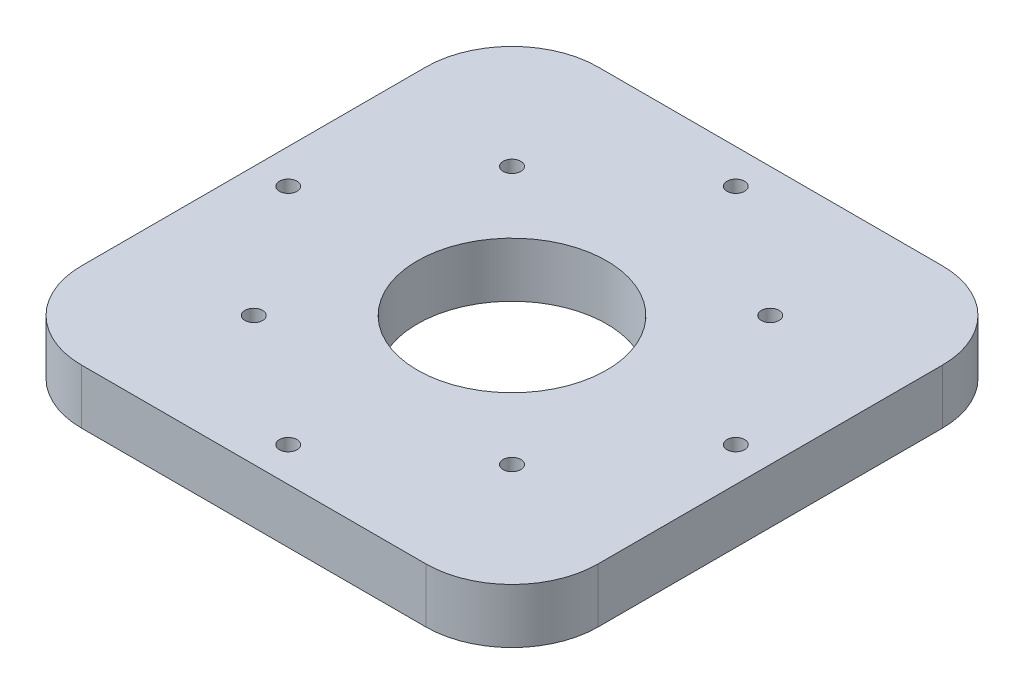
ISO-10303-21;
HEADER;
FILE_DESCRIPTION(('STEP AP214'),'2;1');
FILE_NAME('part.step','',(''),(''),'','','');
FILE_SCHEMA(('AUTOMOTIVE_DESIGN { 1 0 10303 214 1 1 1 1 }'));
ENDSEC;
DATA;
#1=APPLICATION_CONTEXT('core data for automotive mechanical design processes');
#2=APPLICATION_PROTOCOL_DEFINITION('international standard','automotive_design',2000,#1);
#3=PRODUCT_CONTEXT('',#1,'mechanical');
#4=PRODUCT('Part','Part','',(#3));
#5=PRODUCT_RELATED_PRODUCT_CATEGORY('part','',(#4));
#6=PRODUCT_DEFINITION_FORMATION('','',#4);
#7=PRODUCT_DEFINITION_CONTEXT('part definition',#1,'design');
#8=PRODUCT_DEFINITION('design','',#6,#7);
#9=PRODUCT_DEFINITION_SHAPE('','',#8);
#10=(LENGTH_UNIT() NAMED_UNIT(*) SI_UNIT(.MILLI.,.METRE.));
#11=(NAMED_UNIT(*) PLANE_ANGLE_UNIT() SI_UNIT($,.RADIAN.));
#12=(NAMED_UNIT(*) SI_UNIT($,.STERADIAN.) SOLID_ANGLE_UNIT());
#13=UNCERTAINTY_MEASURE_WITH_UNIT(LENGTH_MEASURE(1.E-05),#10,'distance_accuracy_value','');
#14=(GEOMETRIC_REPRESENTATION_CONTEXT(3) GLOBAL_UNCERTAINTY_ASSIGNED_CONTEXT((#13)) GLOBAL_UNIT_ASSIGNED_CONTEXT((#10,
#11,#12)) REPRESENTATION_CONTEXT('',''));
#15=CARTESIAN_POINT('',(0.,0.,0.));
#16=DIRECTION('',(0.,0.,1.));
#17=DIRECTION('',(1.,0.,0.));
#18=AXIS2_PLACEMENT_3D('',#15,#16,#17);
#19=CARTESIAN_POINT('',(0.,6.35,0.));
#20=DIRECTION('',(0.,1.,0.));
#21=DIRECTION('',(0.,0.,1.));
#22=AXIS2_PLACEMENT_3D('',#19,#20,#21);
#23=PLANE('',#22);
#24=CARTESIAN_POINT('',(44.,6.35,76.6703662597115));
#25=DIRECTION('',(0.,1.,0.));
#26=DIRECTION('',(0.,0.,1.));
#27=AXIS2_PLACEMENT_3D('',#24,#25,#26);
#28=CIRCLE('',#27,1.025);
#29=CARTESIAN_POINT('',(44.,6.35,77.6953662597114));
#30=VERTEX_POINT('',#29);
#31=EDGE_CURVE('E226',#30,#30,#28,.T.);
#32=ORIENTED_EDGE('',*,*,#31,.F.);
#33=EDGE_LOOP('',(#32));
#34=FACE_BOUND('',#33,.T.);
#35=CARTESIAN_POINT('',(96.,6.35,76.6703662597115));
#36=DIRECTION('',(0.,1.,0.));
#37=DIRECTION('',(0.,0.,1.));
#38=AXIS2_PLACEMENT_3D('',#35,#36,#37);
#39=CIRCLE('',#38,1.025);
#40=CARTESIAN_POINT('',(96.,6.35,77.6953662597114));
#41=VERTEX_POINT('',#40);
#42=EDGE_CURVE('E220',#41,#41,#39,.T.);
#43=ORIENTED_EDGE('',*,*,#42,.F.);
#44=EDGE_LOOP('',(#43));
#45=FACE_BOUND('',#44,.T.);
#46=CARTESIAN_POINT('',(70.,6.35,50.6703662597115));
#47=DIRECTION('',(0.,1.,0.));
#48=DIRECTION('',(0.,0.,1.));
#49=AXIS2_PLACEMENT_3D('',#46,#47,#48);
#50=CIRCLE('',#49,1.025);
#51=CARTESIAN_POINT('',(70.,6.35,51.6953662597115));
#52=VERTEX_POINT('',#51);
#53=EDGE_CURVE('E214',#52,#52,#50,.T.);
#54=ORIENTED_EDGE('',*,*,#53,.F.);
#55=EDGE_LOOP('',(#54));
#56=FACE_BOUND('',#55,.T.);
#57=CARTESIAN_POINT('',(70.,6.35,102.670366259711));
#58=DIRECTION('',(0.,1.,0.));
#59=DIRECTION('',(0.,0.,1.));
#60=AXIS2_PLACEMENT_3D('',#57,#58,#59);
#61=CIRCLE('',#60,1.025);
#62=CARTESIAN_POINT('',(70.,6.35,103.695366259711));
#63=VERTEX_POINT('',#62);
#64=EDGE_CURVE('E208',#63,#63,#61,.T.);
#65=ORIENTED_EDGE('',*,*,#64,.F.);
#66=EDGE_LOOP('',(#65));
#67=FACE_BOUND('',#66,.T.);
#68=CARTESIAN_POINT('',(85.,6.35,91.6703662597114));
#69=DIRECTION('',(0.,1.,0.));
#70=DIRECTION('',(0.,0.,1.));
#71=AXIS2_PLACEMENT_3D('',#68,#69,#70);
#72=CIRCLE('',#71,1.025);
#73=CARTESIAN_POINT('',(85.,6.35,92.6953662597114));
#74=VERTEX_POINT('',#73);
#75=EDGE_CURVE('E193',#74,#74,#72,.T.);
#76=ORIENTED_EDGE('',*,*,#75,.F.);
#77=EDGE_LOOP('',(#76));
#78=FACE_BOUND('',#77,.T.);
#79=CARTESIAN_POINT('',(55.,6.35,61.6703662597115));
#80=DIRECTION('',(0.,1.,0.));
#81=DIRECTION('',(0.,0.,1.));
#82=AXIS2_PLACEMENT_3D('',#79,#80,#81);
#83=CIRCLE('',#82,1.025);
#84=CARTESIAN_POINT('',(55.,6.35,62.6953662597114));
#85=VERTEX_POINT('',#84);
#86=EDGE_CURVE('E182',#85,#85,#83,.T.);
#87=ORIENTED_EDGE('',*,*,#86,.F.);
#88=EDGE_LOOP('',(#87));
#89=FACE_BOUND('',#88,.T.);
#90=DIRECTION('',(1.,0.,0.));
#91=VECTOR('',#90,1.);
#92=CARTESIAN_POINT('',(40.,6.35,106.670366259711));
#93=LINE('',#92,#91);
#94=CARTESIAN_POINT('',(50.,6.35,106.670366259711));
#95=VERTEX_POINT('',#94);
#96=CARTESIAN_POINT('',(90.,6.35,106.670366259711));
#97=VERTEX_POINT('',#96);
#98=EDGE_CURVE('E168',#95,#97,#93,.T.);
#99=ORIENTED_EDGE('',*,*,#98,.T.);
#100=CARTESIAN_POINT('',(90.,6.35,96.6703662597115));
#101=DIRECTION('',(0.,1.,0.));
#102=DIRECTION('',(0.,0.,1.));
#103=AXIS2_PLACEMENT_3D('',#100,#101,#102);
#104=CIRCLE('',#103,10.);
#105=CARTESIAN_POINT('',(100.,6.35,96.6703662597115));
#106=VERTEX_POINT('',#105);
#107=EDGE_CURVE('E149',#97,#106,#104,.T.);
#108=ORIENTED_EDGE('',*,*,#107,.T.);
#109=DIRECTION('',(0.,0.,-1.));
#110=VECTOR('',#109,1.);
#111=CARTESIAN_POINT('',(100.,6.35,46.6703662597115));
#112=LINE('',#111,#110);
#113=CARTESIAN_POINT('',(100.,6.35,56.6703662597115));
#114=VERTEX_POINT('',#113);
#115=EDGE_CURVE('E119',#106,#114,#112,.T.);
#116=ORIENTED_EDGE('',*,*,#115,.T.);
#117=CARTESIAN_POINT('',(90.,6.35,56.6703662597115));
#118=DIRECTION('',(0.,1.,0.));
#119=DIRECTION('',(0.,0.,1.));
#120=AXIS2_PLACEMENT_3D('',#117,#118,#119);
#121=CIRCLE('',#120,10.);
#122=CARTESIAN_POINT('',(90.,6.35,46.6703662597115));
#123=VERTEX_POINT('',#122);
#124=EDGE_CURVE('E55',#114,#123,#121,.T.);
#125=ORIENTED_EDGE('',*,*,#124,.T.);
#126=DIRECTION('',(-1.,0.,0.));
#127=VECTOR('',#126,1.);
#128=CARTESIAN_POINT('',(40.,6.35,46.6703662597115));
#129=LINE('',#128,#127);
#130=CARTESIAN_POINT('',(50.,6.35,46.6703662597115));
#131=VERTEX_POINT('',#130);
#132=EDGE_CURVE('E135',#123,#131,#129,.T.);
#133=ORIENTED_EDGE('',*,*,#132,.T.);
#134=CARTESIAN_POINT('',(50.,6.35,56.6703662597115));
#135=DIRECTION('',(0.,1.,0.));
#136=DIRECTION('',(0.,0.,1.));
#137=AXIS2_PLACEMENT_3D('',#134,#135,#136);
#138=CIRCLE('',#137,10.);
#139=CARTESIAN_POINT('',(40.,6.35,56.6703662597115));
#140=VERTEX_POINT('',#139);
#141=EDGE_CURVE('E146',#131,#140,#138,.T.);
#142=ORIENTED_EDGE('',*,*,#141,.T.);
#143=DIRECTION('',(0.,0.,1.));
#144=VECTOR('',#143,1.);
#145=CARTESIAN_POINT('',(40.,6.35,46.6703662597115));
#146=LINE('',#145,#144);
#147=CARTESIAN_POINT('',(40.,6.35,96.6703662597115));
#148=VERTEX_POINT('',#147);
#149=EDGE_CURVE('E129',#140,#148,#146,.T.);
#150=ORIENTED_EDGE('',*,*,#149,.T.);
#151=CARTESIAN_POINT('',(50.,6.35,96.6703662597115));
#152=DIRECTION('',(0.,1.,0.));
#153=DIRECTION('',(0.,0.,1.));
#154=AXIS2_PLACEMENT_3D('',#151,#152,#153);
#155=CIRCLE('',#154,10.);
#156=EDGE_CURVE('E144',#148,#95,#155,.T.);
#157=ORIENTED_EDGE('',*,*,#156,.T.);
#158=EDGE_LOOP('',(#99,#108,#116,#125,#133,#142,#150,#157));
#159=FACE_BOUND('',#158,.T.);
#160=CARTESIAN_POINT('',(70.,6.35,76.6703662597115));
#161=DIRECTION('',(0.,1.,0.));
#162=DIRECTION('',(0.,0.,1.));
#163=AXIS2_PLACEMENT_3D('',#160,#161,#162);
#164=CIRCLE('',#163,11.);
#165=CARTESIAN_POINT('',(70.,6.35,87.6703662597114));
#166=VERTEX_POINT('',#165);
#167=EDGE_CURVE('E173',#166,#166,#164,.T.);
#168=ORIENTED_EDGE('',*,*,#167,.F.);
#169=EDGE_LOOP('',(#168));
#170=FACE_BOUND('',#169,.T.);
#171=CARTESIAN_POINT('',(85.,6.35,61.6703662597115));
#172=DIRECTION('',(0.,1.,0.));
#173=DIRECTION('',(0.,0.,1.));
#174=AXIS2_PLACEMENT_3D('',#171,#172,#173);
#175=CIRCLE('',#174,1.025);
#176=CARTESIAN_POINT('',(85.,6.35,62.6953662597114));
#177=VERTEX_POINT('',#176);
#178=EDGE_CURVE('E187',#177,#177,#175,.T.);
#179=ORIENTED_EDGE('',*,*,#178,.F.);
#180=EDGE_LOOP('',(#179));
#181=FACE_BOUND('',#180,.T.);
#182=CARTESIAN_POINT('',(55.,6.35,91.6703662597114));
#183=DIRECTION('',(0.,1.,0.));
#184=DIRECTION('',(0.,0.,1.));
#185=AXIS2_PLACEMENT_3D('',#182,#183,#184);
#186=CIRCLE('',#185,1.025);
#187=CARTESIAN_POINT('',(55.,6.35,92.6953662597114));
#188=VERTEX_POINT('',#187);
#189=EDGE_CURVE('E199',#188,#188,#186,.T.);
#190=ORIENTED_EDGE('',*,*,#189,.F.);
#191=EDGE_LOOP('',(#190));
#192=FACE_BOUND('',#191,.T.);
#193=ADVANCED_FACE('F33',(#34,#45,#56,#67,#78,#89,#159,#170,#181,#192),#23,.T.);
#194=CARTESIAN_POINT('',(0.,0.,0.));
#195=DIRECTION('',(0.,1.,0.));
#196=DIRECTION('',(0.,0.,1.));
#197=AXIS2_PLACEMENT_3D('',#194,#195,#196);
#198=PLANE('',#197);
#199=CARTESIAN_POINT('',(44.,0.,76.6703662597115));
#200=DIRECTION('',(0.,1.,0.));
#201=DIRECTION('',(0.,0.,1.));
#202=AXIS2_PLACEMENT_3D('',#199,#200,#201);
#203=CIRCLE('',#202,1.025);
#204=CARTESIAN_POINT('',(44.,0.,77.6953662597114));
#205=VERTEX_POINT('',#204);
#206=EDGE_CURVE('E205',#205,#205,#203,.T.);
#207=ORIENTED_EDGE('',*,*,#206,.T.);
#208=EDGE_LOOP('',(#207));
#209=FACE_BOUND('',#208,.T.);
#210=CARTESIAN_POINT('',(96.,0.,76.6703662597115));
#211=DIRECTION('',(0.,1.,0.));
#212=DIRECTION('',(0.,0.,1.));
#213=AXIS2_PLACEMENT_3D('',#210,#211,#212);
#214=CIRCLE('',#213,1.025);
#215=CARTESIAN_POINT('',(96.,0.,77.6953662597114));
#216=VERTEX_POINT('',#215);
#217=EDGE_CURVE('E223',#216,#216,#214,.T.);
#218=ORIENTED_EDGE('',*,*,#217,.T.);
#219=EDGE_LOOP('',(#218));
#220=FACE_BOUND('',#219,.T.);
#221=CARTESIAN_POINT('',(70.,0.,50.6703662597115));
#222=DIRECTION('',(0.,1.,0.));
#223=DIRECTION('',(0.,0.,1.));
#224=AXIS2_PLACEMENT_3D('',#221,#222,#223);
#225=CIRCLE('',#224,1.025);
#226=CARTESIAN_POINT('',(70.,0.,51.6953662597115));
#227=VERTEX_POINT('',#226);
#228=EDGE_CURVE('E217',#227,#227,#225,.T.);
#229=ORIENTED_EDGE('',*,*,#228,.T.);
#230=EDGE_LOOP('',(#229));
#231=FACE_BOUND('',#230,.T.);
#232=CARTESIAN_POINT('',(70.,0.,102.670366259711));
#233=DIRECTION('',(0.,1.,0.));
#234=DIRECTION('',(0.,0.,1.));
#235=AXIS2_PLACEMENT_3D('',#232,#233,#234);
#236=CIRCLE('',#235,1.025);
#237=CARTESIAN_POINT('',(70.,0.,103.695366259711));
#238=VERTEX_POINT('',#237);
#239=EDGE_CURVE('E211',#238,#238,#236,.T.);
#240=ORIENTED_EDGE('',*,*,#239,.T.);
#241=EDGE_LOOP('',(#240));
#242=FACE_BOUND('',#241,.T.);
#243=DIRECTION('',(0.,0.,-1.));
#244=VECTOR('',#243,1.);
#245=CARTESIAN_POINT('',(100.,0.,46.6703662597115));
#246=LINE('',#245,#244);
#247=CARTESIAN_POINT('',(100.,0.,96.6703662597115));
#248=VERTEX_POINT('',#247);
#249=CARTESIAN_POINT('',(100.,0.,56.6703662597115));
#250=VERTEX_POINT('',#249);
#251=EDGE_CURVE('E117',#248,#250,#246,.T.);
#252=ORIENTED_EDGE('',*,*,#251,.F.);
#253=CARTESIAN_POINT('',(90.,0.,96.6703662597115));
#254=DIRECTION('',(0.,1.,0.));
#255=DIRECTION('',(0.,0.,1.));
#256=AXIS2_PLACEMENT_3D('',#253,#254,#255);
#257=CIRCLE('',#256,10.);
#258=CARTESIAN_POINT('',(90.,0.,106.670366259711));
#259=VERTEX_POINT('',#258);
#260=EDGE_CURVE('E100',#248,#259,#257,.F.);
#261=ORIENTED_EDGE('',*,*,#260,.T.);
#262=DIRECTION('',(1.,0.,0.));
#263=VECTOR('',#262,1.);
#264=CARTESIAN_POINT('',(40.,0.,106.670366259711));
#265=LINE('',#264,#263);
#266=CARTESIAN_POINT('',(50.,0.,106.670366259711));
#267=VERTEX_POINT('',#266);
#268=EDGE_CURVE('E127',#267,#259,#265,.T.);
#269=ORIENTED_EDGE('',*,*,#268,.F.);
#270=CARTESIAN_POINT('',(50.,0.,96.6703662597115));
#271=DIRECTION('',(0.,1.,0.));
#272=DIRECTION('',(0.,0.,1.));
#273=AXIS2_PLACEMENT_3D('',#270,#271,#272);
#274=CIRCLE('',#273,10.);
#275=CARTESIAN_POINT('',(40.,0.,96.6703662597115));
#276=VERTEX_POINT('',#275);
#277=EDGE_CURVE('E120',#267,#276,#274,.F.);
#278=ORIENTED_EDGE('',*,*,#277,.T.);
#279=DIRECTION('',(0.,0.,1.));
#280=VECTOR('',#279,1.);
#281=CARTESIAN_POINT('',(40.,0.,46.6703662597115));
#282=LINE('',#281,#280);
#283=CARTESIAN_POINT('',(40.,0.,56.6703662597115));
#284=VERTEX_POINT('',#283);
#285=EDGE_CURVE('E131',#284,#276,#282,.T.);
#286=ORIENTED_EDGE('',*,*,#285,.F.);
#287=CARTESIAN_POINT('',(50.,0.,56.6703662597115));
#288=DIRECTION('',(0.,1.,0.));
#289=DIRECTION('',(0.,0.,1.));
#290=AXIS2_PLACEMENT_3D('',#287,#288,#289);
#291=CIRCLE('',#290,10.);
#292=CARTESIAN_POINT('',(50.,0.,46.6703662597115));
#293=VERTEX_POINT('',#292);
#294=EDGE_CURVE('E138',#284,#293,#291,.F.);
#295=ORIENTED_EDGE('',*,*,#294,.T.);
#296=DIRECTION('',(-1.,0.,0.));
#297=VECTOR('',#296,1.);
#298=CARTESIAN_POINT('',(40.,0.,46.6703662597115));
#299=LINE('',#298,#297);
#300=CARTESIAN_POINT('',(90.,0.,46.6703662597115));
#301=VERTEX_POINT('',#300);
#302=EDGE_CURVE('E126',#301,#293,#299,.T.);
#303=ORIENTED_EDGE('',*,*,#302,.F.);
#304=CARTESIAN_POINT('',(90.,0.,56.6703662597115));
#305=DIRECTION('',(0.,1.,0.));
#306=DIRECTION('',(0.,0.,1.));
#307=AXIS2_PLACEMENT_3D('',#304,#305,#306);
#308=CIRCLE('',#307,10.);
#309=EDGE_CURVE('E111',#301,#250,#308,.F.);
#310=ORIENTED_EDGE('',*,*,#309,.T.);
#311=EDGE_LOOP('',(#252,#261,#269,#278,#286,#295,#303,#310));
#312=FACE_BOUND('',#311,.T.);
#313=CARTESIAN_POINT('',(70.,0.,76.6703662597115));
#314=DIRECTION('',(0.,1.,0.));
#315=DIRECTION('',(0.,0.,1.));
#316=AXIS2_PLACEMENT_3D('',#313,#314,#315);
#317=CIRCLE('',#316,11.);
#318=CARTESIAN_POINT('',(70.,0.,87.6703662597114));
#319=VERTEX_POINT('',#318);
#320=EDGE_CURVE('E175',#319,#319,#317,.T.);
#321=ORIENTED_EDGE('',*,*,#320,.T.);
#322=EDGE_LOOP('',(#321));
#323=FACE_BOUND('',#322,.T.);
#324=CARTESIAN_POINT('',(55.,0.,61.6703662597115));
#325=DIRECTION('',(0.,1.,0.));
#326=DIRECTION('',(0.,0.,1.));
#327=AXIS2_PLACEMENT_3D('',#324,#325,#326);
#328=CIRCLE('',#327,1.025);
#329=CARTESIAN_POINT('',(55.,0.,62.6953662597114));
#330=VERTEX_POINT('',#329);
#331=EDGE_CURVE('E184',#330,#330,#328,.T.);
#332=ORIENTED_EDGE('',*,*,#331,.T.);
#333=EDGE_LOOP('',(#332));
#334=FACE_BOUND('',#333,.T.);
#335=CARTESIAN_POINT('',(85.,0.,61.6703662597115));
#336=DIRECTION('',(0.,1.,0.));
#337=DIRECTION('',(0.,0.,1.));
#338=AXIS2_PLACEMENT_3D('',#335,#336,#337);
#339=CIRCLE('',#338,1.025);
#340=CARTESIAN_POINT('',(85.,0.,62.6953662597114));
#341=VERTEX_POINT('',#340);
#342=EDGE_CURVE('E190',#341,#341,#339,.T.);
#343=ORIENTED_EDGE('',*,*,#342,.T.);
#344=EDGE_LOOP('',(#343));
#345=FACE_BOUND('',#344,.T.);
#346=CARTESIAN_POINT('',(85.,0.,91.6703662597114));
#347=DIRECTION('',(0.,1.,0.));
#348=DIRECTION('',(0.,0.,1.));
#349=AXIS2_PLACEMENT_3D('',#346,#347,#348);
#350=CIRCLE('',#349,1.025);
#351=CARTESIAN_POINT('',(85.,0.,92.6953662597114));
#352=VERTEX_POINT('',#351);
#353=EDGE_CURVE('E196',#352,#352,#350,.T.);
#354=ORIENTED_EDGE('',*,*,#353,.T.);
#355=EDGE_LOOP('',(#354));
#356=FACE_BOUND('',#355,.T.);
#357=CARTESIAN_POINT('',(55.,0.,91.6703662597114));
#358=DIRECTION('',(0.,1.,0.));
#359=DIRECTION('',(0.,0.,1.));
#360=AXIS2_PLACEMENT_3D('',#357,#358,#359);
#361=CIRCLE('',#360,1.025);
#362=CARTESIAN_POINT('',(55.,0.,92.6953662597114));
#363=VERTEX_POINT('',#362);
#364=EDGE_CURVE('E202',#363,#363,#361,.T.);
#365=ORIENTED_EDGE('',*,*,#364,.T.);
#366=EDGE_LOOP('',(#365));
#367=FACE_BOUND('',#366,.T.);
#368=ADVANCED_FACE('F123',(#209,#220,#231,#242,#312,#323,#334,#345,#356,#367),#198,.F.);
#369=CARTESIAN_POINT('',(40.,6.35,46.6703662597115));
#370=DIRECTION('',(1.,0.,0.));
#371=DIRECTION('',(0.,0.,-1.));
#372=AXIS2_PLACEMENT_3D('',#369,#370,#371);
#373=PLANE('',#372);
#374=ORIENTED_EDGE('',*,*,#149,.F.);
#375=DIRECTION('',(0.,-1.,0.));
#376=VECTOR('',#375,1.);
#377=CARTESIAN_POINT('',(40.,6.35,56.6703662597115));
#378=LINE('',#377,#376);
#379=EDGE_CURVE('E11',#140,#284,#378,.T.);
#380=ORIENTED_EDGE('',*,*,#379,.T.);
#381=ORIENTED_EDGE('',*,*,#285,.T.);
#382=DIRECTION('',(0.,-1.,0.));
#383=VECTOR('',#382,1.);
#384=CARTESIAN_POINT('',(40.,6.35,96.6703662597115));
#385=LINE('',#384,#383);
#386=EDGE_CURVE('E41',#276,#148,#385,.F.);
#387=ORIENTED_EDGE('',*,*,#386,.T.);
#388=EDGE_LOOP('',(#374,#380,#381,#387));
#389=FACE_BOUND('',#388,.T.);
#390=ADVANCED_FACE('F159',(#389),#373,.F.);
#391=CARTESIAN_POINT('',(40.,6.35,106.670366259711));
#392=DIRECTION('',(0.,0.,-1.));
#393=DIRECTION('',(-1.,0.,0.));
#394=AXIS2_PLACEMENT_3D('',#391,#392,#393);
#395=PLANE('',#394);
#396=ORIENTED_EDGE('',*,*,#268,.T.);
#397=DIRECTION('',(0.,-1.,0.));
#398=VECTOR('',#397,1.);
#399=CARTESIAN_POINT('',(90.,6.35,106.670366259711));
#400=LINE('',#399,#398);
#401=EDGE_CURVE('E105',#259,#97,#400,.F.);
#402=ORIENTED_EDGE('',*,*,#401,.T.);
#403=ORIENTED_EDGE('',*,*,#98,.F.);
#404=DIRECTION('',(0.,-1.,0.));
#405=VECTOR('',#404,1.);
#406=CARTESIAN_POINT('',(50.,6.35,106.670366259711));
#407=LINE('',#406,#405);
#408=EDGE_CURVE('E110',#95,#267,#407,.T.);
#409=ORIENTED_EDGE('',*,*,#408,.T.);
#410=EDGE_LOOP('',(#396,#402,#403,#409));
#411=FACE_BOUND('',#410,.T.);
#412=ADVANCED_FACE('F172',(#411),#395,.F.);
#413=CARTESIAN_POINT('',(100.,6.35,46.6703662597115));
#414=DIRECTION('',(-1.,0.,0.));
#415=DIRECTION('',(0.,0.,1.));
#416=AXIS2_PLACEMENT_3D('',#413,#414,#415);
#417=PLANE('',#416);
#418=ORIENTED_EDGE('',*,*,#115,.F.);
#419=DIRECTION('',(0.,-1.,0.));
#420=VECTOR('',#419,1.);
#421=CARTESIAN_POINT('',(100.,6.35,96.6703662597115));
#422=LINE('',#421,#420);
#423=EDGE_CURVE('E104',#106,#248,#422,.T.);
#424=ORIENTED_EDGE('',*,*,#423,.T.);
#425=ORIENTED_EDGE('',*,*,#251,.T.);
#426=DIRECTION('',(0.,-1.,0.));
#427=VECTOR('',#426,1.);
#428=CARTESIAN_POINT('',(100.,6.35,56.6703662597115));
#429=LINE('',#428,#427);
#430=EDGE_CURVE('E121',#250,#114,#429,.F.);
#431=ORIENTED_EDGE('',*,*,#430,.T.);
#432=EDGE_LOOP('',(#418,#424,#425,#431));
#433=FACE_BOUND('',#432,.T.);
#434=ADVANCED_FACE('F116',(#433),#417,.F.);
#435=CARTESIAN_POINT('',(40.,6.35,46.6703662597115));
#436=DIRECTION('',(0.,0.,1.));
#437=DIRECTION('',(1.,0.,0.));
#438=AXIS2_PLACEMENT_3D('',#435,#436,#437);
#439=PLANE('',#438);
#440=ORIENTED_EDGE('',*,*,#132,.F.);
#441=DIRECTION('',(0.,-1.,0.));
#442=VECTOR('',#441,1.);
#443=CARTESIAN_POINT('',(90.,6.35,46.6703662597115));
#444=LINE('',#443,#442);
#445=EDGE_CURVE('E152',#123,#301,#444,.T.);
#446=ORIENTED_EDGE('',*,*,#445,.T.);
#447=ORIENTED_EDGE('',*,*,#302,.T.);
#448=DIRECTION('',(0.,-1.,0.));
#449=VECTOR('',#448,1.);
#450=CARTESIAN_POINT('',(50.,6.35,46.6703662597115));
#451=LINE('',#450,#449);
#452=EDGE_CURVE('E48',#293,#131,#451,.F.);
#453=ORIENTED_EDGE('',*,*,#452,.T.);
#454=EDGE_LOOP('',(#440,#446,#447,#453));
#455=FACE_BOUND('',#454,.T.);
#456=ADVANCED_FACE('F292',(#455),#439,.F.);
#457=CARTESIAN_POINT('',(70.,6.35,76.6703662597115));
#458=DIRECTION('',(0.,-1.,0.));
#459=DIRECTION('',(0.,0.,-1.));
#460=AXIS2_PLACEMENT_3D('',#457,#458,#459);
#461=CYLINDRICAL_SURFACE('',#460,11.);
#462=ORIENTED_EDGE('',*,*,#167,.T.);
#463=EDGE_LOOP('',(#462));
#464=FACE_BOUND('',#463,.T.);
#465=ORIENTED_EDGE('',*,*,#320,.F.);
#466=EDGE_LOOP('',(#465));
#467=FACE_BOUND('',#466,.T.);
#468=ADVANCED_FACE('F258',(#464,#467),#461,.F.);
#469=CARTESIAN_POINT('',(55.,6.35,61.6703662597115));
#470=DIRECTION('',(0.,-1.,0.));
#471=DIRECTION('',(0.,0.,-1.));
#472=AXIS2_PLACEMENT_3D('',#469,#470,#471);
#473=CYLINDRICAL_SURFACE('',#472,1.025);
#474=ORIENTED_EDGE('',*,*,#86,.T.);
#475=EDGE_LOOP('',(#474));
#476=FACE_BOUND('',#475,.T.);
#477=ORIENTED_EDGE('',*,*,#331,.F.);
#478=EDGE_LOOP('',(#477));
#479=FACE_BOUND('',#478,.T.);
#480=ADVANCED_FACE('F254',(#476,#479),#473,.F.);
#481=CARTESIAN_POINT('',(85.,6.35,61.6703662597115));
#482=DIRECTION('',(0.,-1.,0.));
#483=DIRECTION('',(0.,0.,-1.));
#484=AXIS2_PLACEMENT_3D('',#481,#482,#483);
#485=CYLINDRICAL_SURFACE('',#484,1.025);
#486=ORIENTED_EDGE('',*,*,#178,.T.);
#487=EDGE_LOOP('',(#486));
#488=FACE_BOUND('',#487,.T.);
#489=ORIENTED_EDGE('',*,*,#342,.F.);
#490=EDGE_LOOP('',(#489));
#491=FACE_BOUND('',#490,.T.);
#492=ADVANCED_FACE('F257',(#488,#491),#485,.F.);
#493=CARTESIAN_POINT('',(85.,6.35,91.6703662597114));
#494=DIRECTION('',(0.,-1.,0.));
#495=DIRECTION('',(0.,0.,-1.));
#496=AXIS2_PLACEMENT_3D('',#493,#494,#495);
#497=CYLINDRICAL_SURFACE('',#496,1.025);
#498=ORIENTED_EDGE('',*,*,#75,.T.);
#499=EDGE_LOOP('',(#498));
#500=FACE_BOUND('',#499,.T.);
#501=ORIENTED_EDGE('',*,*,#353,.F.);
#502=EDGE_LOOP('',(#501));
#503=FACE_BOUND('',#502,.T.);
#504=ADVANCED_FACE('F273',(#500,#503),#497,.F.);
#505=CARTESIAN_POINT('',(55.,6.35,91.6703662597114));
#506=DIRECTION('',(0.,-1.,0.));
#507=DIRECTION('',(0.,0.,-1.));
#508=AXIS2_PLACEMENT_3D('',#505,#506,#507);
#509=CYLINDRICAL_SURFACE('',#508,1.025);
#510=ORIENTED_EDGE('',*,*,#189,.T.);
#511=EDGE_LOOP('',(#510));
#512=FACE_BOUND('',#511,.T.);
#513=ORIENTED_EDGE('',*,*,#364,.F.);
#514=EDGE_LOOP('',(#513));
#515=FACE_BOUND('',#514,.T.);
#516=ADVANCED_FACE('F271',(#512,#515),#509,.F.);
#517=CARTESIAN_POINT('',(90.,6.35,96.6703662597115));
#518=DIRECTION('',(0.,-1.,0.));
#519=DIRECTION('',(0.,0.,-1.));
#520=AXIS2_PLACEMENT_3D('',#517,#518,#519);
#521=CYLINDRICAL_SURFACE('',#520,10.);
#522=ORIENTED_EDGE('',*,*,#107,.F.);
#523=ORIENTED_EDGE('',*,*,#401,.F.);
#524=ORIENTED_EDGE('',*,*,#260,.F.);
#525=ORIENTED_EDGE('',*,*,#423,.F.);
#526=EDGE_LOOP('',(#522,#523,#524,#525));
#527=FACE_BOUND('',#526,.T.);
#528=ADVANCED_FACE('F103',(#527),#521,.T.);
#529=CARTESIAN_POINT('',(90.,6.35,56.6703662597115));
#530=DIRECTION('',(0.,-1.,0.));
#531=DIRECTION('',(0.,0.,-1.));
#532=AXIS2_PLACEMENT_3D('',#529,#530,#531);
#533=CYLINDRICAL_SURFACE('',#532,10.);
#534=ORIENTED_EDGE('',*,*,#124,.F.);
#535=ORIENTED_EDGE('',*,*,#430,.F.);
#536=ORIENTED_EDGE('',*,*,#309,.F.);
#537=ORIENTED_EDGE('',*,*,#445,.F.);
#538=EDGE_LOOP('',(#534,#535,#536,#537));
#539=FACE_BOUND('',#538,.T.);
#540=ADVANCED_FACE('F280',(#539),#533,.T.);
#541=CARTESIAN_POINT('',(50.,6.35,56.6703662597115));
#542=DIRECTION('',(0.,-1.,0.));
#543=DIRECTION('',(0.,0.,-1.));
#544=AXIS2_PLACEMENT_3D('',#541,#542,#543);
#545=CYLINDRICAL_SURFACE('',#544,10.);
#546=ORIENTED_EDGE('',*,*,#141,.F.);
#547=ORIENTED_EDGE('',*,*,#452,.F.);
#548=ORIENTED_EDGE('',*,*,#294,.F.);
#549=ORIENTED_EDGE('',*,*,#379,.F.);
#550=EDGE_LOOP('',(#546,#547,#548,#549));
#551=FACE_BOUND('',#550,.T.);
#552=ADVANCED_FACE('F304',(#551),#545,.T.);
#553=CARTESIAN_POINT('',(50.,6.35,96.6703662597115));
#554=DIRECTION('',(0.,-1.,0.));
#555=DIRECTION('',(0.,0.,-1.));
#556=AXIS2_PLACEMENT_3D('',#553,#554,#555);
#557=CYLINDRICAL_SURFACE('',#556,10.);
#558=ORIENTED_EDGE('',*,*,#156,.F.);
#559=ORIENTED_EDGE('',*,*,#386,.F.);
#560=ORIENTED_EDGE('',*,*,#277,.F.);
#561=ORIENTED_EDGE('',*,*,#408,.F.);
#562=EDGE_LOOP('',(#558,#559,#560,#561));
#563=FACE_BOUND('',#562,.T.);
#564=ADVANCED_FACE('F35',(#563),#557,.T.);
#565=CARTESIAN_POINT('',(70.,0.,102.670366259711));
#566=DIRECTION('',(0.,1.,0.));
#567=DIRECTION('',(0.,0.,1.));
#568=AXIS2_PLACEMENT_3D('',#565,#566,#567);
#569=CYLINDRICAL_SURFACE('',#568,1.025);
#570=ORIENTED_EDGE('',*,*,#239,.F.);
#571=EDGE_LOOP('',(#570));
#572=FACE_BOUND('',#571,.T.);
#573=ORIENTED_EDGE('',*,*,#64,.T.);
#574=EDGE_LOOP('',(#573));
#575=FACE_BOUND('',#574,.T.);
#576=ADVANCED_FACE('F285',(#572,#575),#569,.F.);
#577=CARTESIAN_POINT('',(70.,0.,50.6703662597115));
#578=DIRECTION('',(0.,1.,0.));
#579=DIRECTION('',(0.,0.,1.));
#580=AXIS2_PLACEMENT_3D('',#577,#578,#579);
#581=CYLINDRICAL_SURFACE('',#580,1.025);
#582=ORIENTED_EDGE('',*,*,#228,.F.);
#583=EDGE_LOOP('',(#582));
#584=FACE_BOUND('',#583,.T.);
#585=ORIENTED_EDGE('',*,*,#53,.T.);
#586=EDGE_LOOP('',(#585));
#587=FACE_BOUND('',#586,.T.);
#588=ADVANCED_FACE('F314',(#584,#587),#581,.F.);
#589=CARTESIAN_POINT('',(96.,0.,76.6703662597115));
#590=DIRECTION('',(0.,1.,0.));
#591=DIRECTION('',(0.,0.,1.));
#592=AXIS2_PLACEMENT_3D('',#589,#590,#591);
#593=CYLINDRICAL_SURFACE('',#592,1.025);
#594=ORIENTED_EDGE('',*,*,#217,.F.);
#595=EDGE_LOOP('',(#594));
#596=FACE_BOUND('',#595,.T.);
#597=ORIENTED_EDGE('',*,*,#42,.T.);
#598=EDGE_LOOP('',(#597));
#599=FACE_BOUND('',#598,.T.);
#600=ADVANCED_FACE('F237',(#596,#599),#593,.F.);
#601=CARTESIAN_POINT('',(44.,0.,76.6703662597115));
#602=DIRECTION('',(0.,1.,0.));
#603=DIRECTION('',(0.,0.,1.));
#604=AXIS2_PLACEMENT_3D('',#601,#602,#603);
#605=CYLINDRICAL_SURFACE('',#604,1.025);
#606=ORIENTED_EDGE('',*,*,#206,.F.);
#607=EDGE_LOOP('',(#606));
#608=FACE_BOUND('',#607,.T.);
#609=ORIENTED_EDGE('',*,*,#31,.T.);
#610=EDGE_LOOP('',(#609));
#611=FACE_BOUND('',#610,.T.);
#612=ADVANCED_FACE('F234',(#608,#611),#605,.F.);
#613=CLOSED_SHELL('',(#193,#368,#390,#412,#434,#456,#468,#480,#492,#504,#516,#528,#540,#552,
#564,#576,#588,#600,#612));
#614=MANIFOLD_SOLID_BREP('B2',#613);
#615=ADVANCED_BREP_SHAPE_REPRESENTATION('',(#18,#614),#14);
#616=SHAPE_DEFINITION_REPRESENTATION(#9,#615);
ENDSEC;
END-ISO-10303-21;
